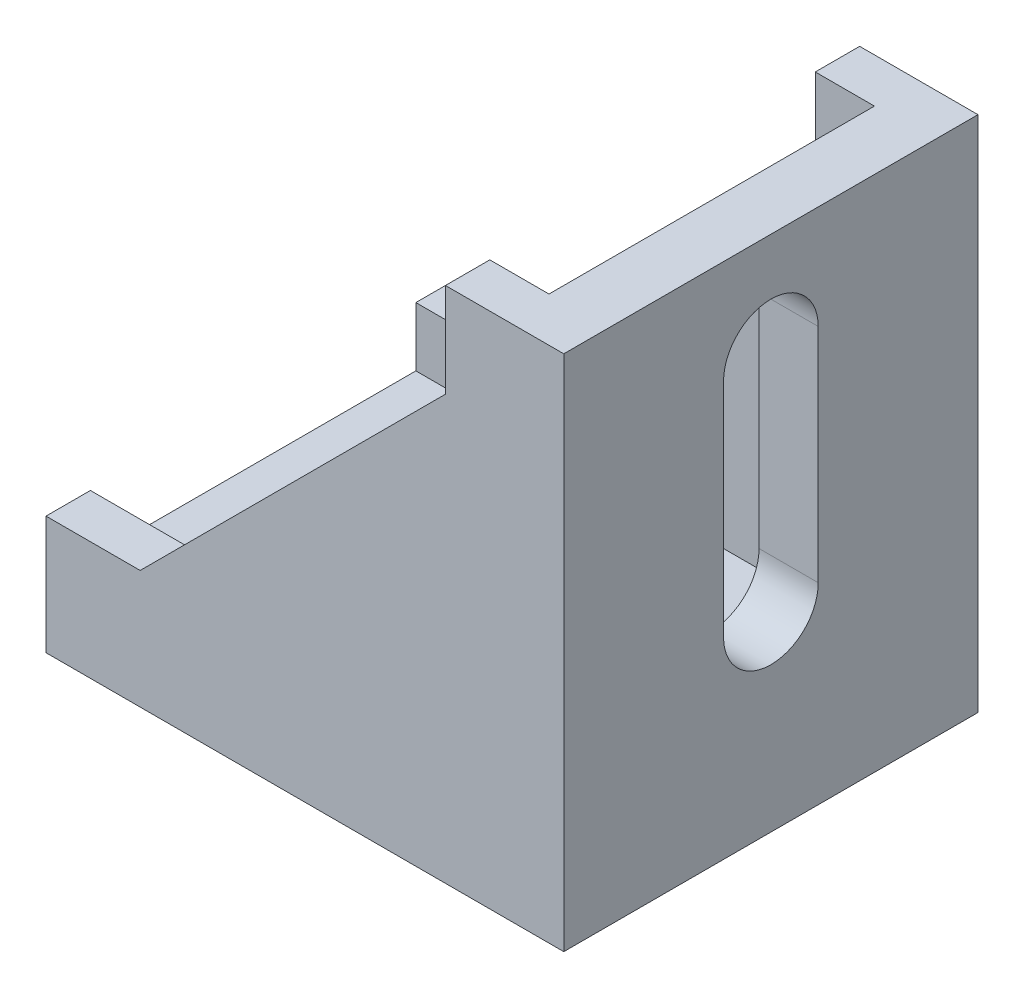
ISO-10303-21;
HEADER;
FILE_DESCRIPTION(('STEP AP214'),'2;1');
FILE_NAME('part.step','',(''),(''),'','','');
FILE_SCHEMA(('AUTOMOTIVE_DESIGN { 1 0 10303 214 1 1 1 1 }'));
ENDSEC;
DATA;
#1=APPLICATION_CONTEXT('core data for automotive mechanical design processes');
#2=APPLICATION_PROTOCOL_DEFINITION('international standard','automotive_design',2000,#1);
#3=PRODUCT_CONTEXT('',#1,'mechanical');
#4=PRODUCT('Part','Part','',(#3));
#5=PRODUCT_RELATED_PRODUCT_CATEGORY('part','',(#4));
#6=PRODUCT_DEFINITION_FORMATION('','',#4);
#7=PRODUCT_DEFINITION_CONTEXT('part definition',#1,'design');
#8=PRODUCT_DEFINITION('design','',#6,#7);
#9=PRODUCT_DEFINITION_SHAPE('','',#8);
#10=(LENGTH_UNIT() NAMED_UNIT(*) SI_UNIT(.MILLI.,.METRE.));
#11=(NAMED_UNIT(*) PLANE_ANGLE_UNIT() SI_UNIT($,.RADIAN.));
#12=(NAMED_UNIT(*) SI_UNIT($,.STERADIAN.) SOLID_ANGLE_UNIT());
#13=UNCERTAINTY_MEASURE_WITH_UNIT(LENGTH_MEASURE(1.E-05),#10,'distance_accuracy_value','');
#14=(GEOMETRIC_REPRESENTATION_CONTEXT(3) GLOBAL_UNCERTAINTY_ASSIGNED_CONTEXT((#13)) GLOBAL_UNIT_ASSIGNED_CONTEXT((#10,
#11,#12)) REPRESENTATION_CONTEXT('',''));
#15=CARTESIAN_POINT('',(0.,0.,0.));
#16=DIRECTION('',(0.,0.,1.));
#17=DIRECTION('',(1.,0.,0.));
#18=AXIS2_PLACEMENT_3D('',#15,#16,#17);
#19=CARTESIAN_POINT('',(-17.5,35.,14.));
#20=DIRECTION('',(1.,0.,0.));
#21=DIRECTION('',(0.,0.,-1.));
#22=AXIS2_PLACEMENT_3D('',#19,#20,#21);
#23=PLANE('',#22);
#24=DIRECTION('',(0.,-1.,0.));
#25=VECTOR('',#24,1.);
#26=CARTESIAN_POINT('',(-17.5,35.,14.));
#27=LINE('',#26,#25);
#28=CARTESIAN_POINT('',(-17.5,8.,14.));
#29=VERTEX_POINT('',#28);
#30=CARTESIAN_POINT('',(-17.5,0.,14.));
#31=VERTEX_POINT('',#30);
#32=EDGE_CURVE('E350',#29,#31,#27,.T.);
#33=ORIENTED_EDGE('',*,*,#32,.F.);
#34=DIRECTION('',(0.,0.,-1.));
#35=VECTOR('',#34,1.);
#36=CARTESIAN_POINT('',(-17.5,8.,116.335336040565));
#37=LINE('',#36,#35);
#38=CARTESIAN_POINT('',(-17.5,8.,11.));
#39=VERTEX_POINT('',#38);
#40=EDGE_CURVE('E262',#29,#39,#37,.T.);
#41=ORIENTED_EDGE('',*,*,#40,.T.);
#42=DIRECTION('',(0.,-1.,0.));
#43=VECTOR('',#42,1.);
#44=CARTESIAN_POINT('',(-17.5,35.,11.));
#45=LINE('',#44,#43);
#46=CARTESIAN_POINT('',(-17.5,4.,11.));
#47=VERTEX_POINT('',#46);
#48=EDGE_CURVE('E319',#39,#47,#45,.T.);
#49=ORIENTED_EDGE('',*,*,#48,.T.);
#50=DIRECTION('',(0.,0.,1.));
#51=VECTOR('',#50,1.);
#52=CARTESIAN_POINT('',(-17.5,4.,14.));
#53=LINE('',#52,#51);
#54=CARTESIAN_POINT('',(-17.5,4.,-11.));
#55=VERTEX_POINT('',#54);
#56=EDGE_CURVE('E354',#55,#47,#53,.T.);
#57=ORIENTED_EDGE('',*,*,#56,.F.);
#58=DIRECTION('',(0.,1.,0.));
#59=VECTOR('',#58,1.);
#60=CARTESIAN_POINT('',(-17.5,35.,-11.));
#61=LINE('',#60,#59);
#62=CARTESIAN_POINT('',(-17.5,8.,-11.));
#63=VERTEX_POINT('',#62);
#64=EDGE_CURVE('E321',#55,#63,#61,.T.);
#65=ORIENTED_EDGE('',*,*,#64,.T.);
#66=CARTESIAN_POINT('',(-17.5,8.,-13.9999999999999));
#67=VERTEX_POINT('',#66);
#68=EDGE_CURVE('E259',#63,#67,#37,.T.);
#69=ORIENTED_EDGE('',*,*,#68,.T.);
#70=DIRECTION('',(0.,-1.,0.));
#71=VECTOR('',#70,1.);
#72=CARTESIAN_POINT('',(-17.5,35.,-14.));
#73=LINE('',#72,#71);
#74=CARTESIAN_POINT('',(-17.5,0.,-14.));
#75=VERTEX_POINT('',#74);
#76=EDGE_CURVE('E333',#67,#75,#73,.T.);
#77=ORIENTED_EDGE('',*,*,#76,.T.);
#78=DIRECTION('',(0.,0.,1.));
#79=VECTOR('',#78,1.);
#80=CARTESIAN_POINT('',(-17.5,0.,14.));
#81=LINE('',#80,#79);
#82=EDGE_CURVE('E324',#75,#31,#81,.T.);
#83=ORIENTED_EDGE('',*,*,#82,.T.);
#84=EDGE_LOOP('',(#33,#41,#49,#57,#65,#69,#77,#83));
#85=FACE_BOUND('',#84,.T.);
#86=ADVANCED_FACE('F43',(#85),#23,.F.);
#87=CARTESIAN_POINT('',(17.5,35.,14.));
#88=DIRECTION('',(0.,0.,-1.));
#89=DIRECTION('',(-1.,0.,0.));
#90=AXIS2_PLACEMENT_3D('',#87,#88,#89);
#91=PLANE('',#90);
#92=DIRECTION('',(1.,0.,0.));
#93=VECTOR('',#92,1.);
#94=CARTESIAN_POINT('',(17.5,35.,14.));
#95=LINE('',#94,#93);
#96=CARTESIAN_POINT('',(9.49999999999996,35.,14.));
#97=VERTEX_POINT('',#96);
#98=CARTESIAN_POINT('',(17.5,35.,14.));
#99=VERTEX_POINT('',#98);
#100=EDGE_CURVE('E325',#97,#99,#95,.T.);
#101=ORIENTED_EDGE('',*,*,#100,.F.);
#102=DIRECTION('',(0.,-1.,0.));
#103=VECTOR('',#102,1.);
#104=CARTESIAN_POINT('',(9.49999999999996,35.,14.));
#105=LINE('',#104,#103);
#106=CARTESIAN_POINT('',(9.49999999999992,28.6347364830961,14.));
#107=VERTEX_POINT('',#106);
#108=EDGE_CURVE('E297',#97,#107,#105,.T.);
#109=ORIENTED_EDGE('',*,*,#108,.T.);
#110=DIRECTION('',(-0.707106781186546,-0.707106781186549,0.));
#111=VECTOR('',#110,1.);
#112=CARTESIAN_POINT('',(16.6826317584519,35.8173682415481,14.));
#113=LINE('',#112,#111);
#114=CARTESIAN_POINT('',(-11.1347364830961,8.,14.));
#115=VERTEX_POINT('',#114);
#116=EDGE_CURVE('E288',#107,#115,#113,.T.);
#117=ORIENTED_EDGE('',*,*,#116,.T.);
#118=DIRECTION('',(-1.,0.,0.));
#119=VECTOR('',#118,1.);
#120=CARTESIAN_POINT('',(17.5,8.,14.));
#121=LINE('',#120,#119);
#122=EDGE_CURVE('E279',#115,#29,#121,.T.);
#123=ORIENTED_EDGE('',*,*,#122,.T.);
#124=ORIENTED_EDGE('',*,*,#32,.T.);
#125=DIRECTION('',(1.,0.,0.));
#126=VECTOR('',#125,1.);
#127=CARTESIAN_POINT('',(17.5,0.,14.));
#128=LINE('',#127,#126);
#129=CARTESIAN_POINT('',(17.5,0.,14.));
#130=VERTEX_POINT('',#129);
#131=EDGE_CURVE('E336',#31,#130,#128,.T.);
#132=ORIENTED_EDGE('',*,*,#131,.T.);
#133=DIRECTION('',(0.,-1.,0.));
#134=VECTOR('',#133,1.);
#135=CARTESIAN_POINT('',(17.5,35.,14.));
#136=LINE('',#135,#134);
#137=EDGE_CURVE('E347',#99,#130,#136,.T.);
#138=ORIENTED_EDGE('',*,*,#137,.F.);
#139=EDGE_LOOP('',(#101,#109,#117,#123,#124,#132,#138));
#140=FACE_BOUND('',#139,.T.);
#141=ADVANCED_FACE('F375',(#140),#91,.F.);
#142=CARTESIAN_POINT('',(17.5,35.,14.));
#143=DIRECTION('',(-1.,0.,0.));
#144=DIRECTION('',(0.,0.,1.));
#145=AXIS2_PLACEMENT_3D('',#142,#143,#144);
#146=PLANE('',#145);
#147=DIRECTION('',(0.,-1.,0.));
#148=VECTOR('',#147,1.);
#149=CARTESIAN_POINT('',(17.5,27.9999999999999,3.20000000000002));
#150=LINE('',#149,#148);
#151=CARTESIAN_POINT('',(17.5,27.9999999999999,3.20000000000002));
#152=VERTEX_POINT('',#151);
#153=CARTESIAN_POINT('',(17.5,12.9999999999999,3.20000000000002));
#154=VERTEX_POINT('',#153);
#155=EDGE_CURVE('E211',#152,#154,#150,.T.);
#156=ORIENTED_EDGE('',*,*,#155,.F.);
#157=CARTESIAN_POINT('',(17.5,27.9999999999999,0.));
#158=DIRECTION('',(-1.,0.,0.));
#159=DIRECTION('',(0.,0.,1.));
#160=AXIS2_PLACEMENT_3D('',#157,#158,#159);
#161=CIRCLE('',#160,3.2);
#162=CARTESIAN_POINT('',(17.5,27.9999999999999,-3.19999999999998));
#163=VERTEX_POINT('',#162);
#164=EDGE_CURVE('E193',#163,#152,#161,.F.);
#165=ORIENTED_EDGE('',*,*,#164,.F.);
#166=DIRECTION('',(0.,1.,0.));
#167=VECTOR('',#166,1.);
#168=CARTESIAN_POINT('',(17.5,27.9999999999999,-3.19999999999998));
#169=LINE('',#168,#167);
#170=CARTESIAN_POINT('',(17.5,12.9999999999999,-3.19999999999998));
#171=VERTEX_POINT('',#170);
#172=EDGE_CURVE('E202',#171,#163,#169,.T.);
#173=ORIENTED_EDGE('',*,*,#172,.F.);
#174=CARTESIAN_POINT('',(17.5,12.9999999999999,0.));
#175=DIRECTION('',(-1.,0.,0.));
#176=DIRECTION('',(0.,0.,1.));
#177=AXIS2_PLACEMENT_3D('',#174,#175,#176);
#178=CIRCLE('',#177,3.2);
#179=EDGE_CURVE('E57',#154,#171,#178,.F.);
#180=ORIENTED_EDGE('',*,*,#179,.F.);
#181=EDGE_LOOP('',(#156,#165,#173,#180));
#182=FACE_BOUND('',#181,.T.);
#183=DIRECTION('',(0.,0.,-1.));
#184=VECTOR('',#183,1.);
#185=CARTESIAN_POINT('',(17.5,0.,14.));
#186=LINE('',#185,#184);
#187=CARTESIAN_POINT('',(17.5,0.,-14.));
#188=VERTEX_POINT('',#187);
#189=EDGE_CURVE('E338',#130,#188,#186,.T.);
#190=ORIENTED_EDGE('',*,*,#189,.T.);
#191=DIRECTION('',(0.,-1.,0.));
#192=VECTOR('',#191,1.);
#193=CARTESIAN_POINT('',(17.5,35.,-14.));
#194=LINE('',#193,#192);
#195=CARTESIAN_POINT('',(17.5,35.,-14.));
#196=VERTEX_POINT('',#195);
#197=EDGE_CURVE('E344',#196,#188,#194,.T.);
#198=ORIENTED_EDGE('',*,*,#197,.F.);
#199=DIRECTION('',(0.,0.,-1.));
#200=VECTOR('',#199,1.);
#201=CARTESIAN_POINT('',(17.5,35.,14.));
#202=LINE('',#201,#200);
#203=EDGE_CURVE('E327',#99,#196,#202,.T.);
#204=ORIENTED_EDGE('',*,*,#203,.F.);
#205=ORIENTED_EDGE('',*,*,#137,.T.);
#206=EDGE_LOOP('',(#190,#198,#204,#205));
#207=FACE_BOUND('',#206,.T.);
#208=ADVANCED_FACE('F208',(#182,#207),#146,.F.);
#209=CARTESIAN_POINT('',(17.5,35.,-14.));
#210=DIRECTION('',(0.,0.,1.));
#211=DIRECTION('',(1.,0.,0.));
#212=AXIS2_PLACEMENT_3D('',#209,#210,#211);
#213=PLANE('',#212);
#214=DIRECTION('',(0.707106781186546,0.707106781186549,0.));
#215=VECTOR('',#214,1.);
#216=CARTESIAN_POINT('',(16.6826317584519,35.8173682415481,-14.));
#217=LINE('',#216,#215);
#218=CARTESIAN_POINT('',(-11.1347364830961,8.,-13.9999999999999));
#219=VERTEX_POINT('',#218);
#220=CARTESIAN_POINT('',(9.49999999999992,28.6347364830961,-13.9999999999999));
#221=VERTEX_POINT('',#220);
#222=EDGE_CURVE('E285',#219,#221,#217,.T.);
#223=ORIENTED_EDGE('',*,*,#222,.T.);
#224=DIRECTION('',(0.,1.,0.));
#225=VECTOR('',#224,1.);
#226=CARTESIAN_POINT('',(9.49999999999996,35.,-14.));
#227=LINE('',#226,#225);
#228=CARTESIAN_POINT('',(9.49999999999996,35.,-13.9999999999999));
#229=VERTEX_POINT('',#228);
#230=EDGE_CURVE('E294',#221,#229,#227,.T.);
#231=ORIENTED_EDGE('',*,*,#230,.T.);
#232=DIRECTION('',(-1.,0.,0.));
#233=VECTOR('',#232,1.);
#234=CARTESIAN_POINT('',(17.5,35.,-14.));
#235=LINE('',#234,#233);
#236=EDGE_CURVE('E330',#196,#229,#235,.T.);
#237=ORIENTED_EDGE('',*,*,#236,.F.);
#238=ORIENTED_EDGE('',*,*,#197,.T.);
#239=DIRECTION('',(-1.,0.,0.));
#240=VECTOR('',#239,1.);
#241=CARTESIAN_POINT('',(17.5,0.,-14.));
#242=LINE('',#241,#240);
#243=EDGE_CURVE('E328',#188,#75,#242,.T.);
#244=ORIENTED_EDGE('',*,*,#243,.T.);
#245=ORIENTED_EDGE('',*,*,#76,.F.);
#246=DIRECTION('',(1.,0.,0.));
#247=VECTOR('',#246,1.);
#248=CARTESIAN_POINT('',(17.5,8.,-14.));
#249=LINE('',#248,#247);
#250=EDGE_CURVE('E276',#67,#219,#249,.T.);
#251=ORIENTED_EDGE('',*,*,#250,.T.);
#252=EDGE_LOOP('',(#223,#231,#237,#238,#244,#245,#251));
#253=FACE_BOUND('',#252,.T.);
#254=ADVANCED_FACE('F406',(#253),#213,.F.);
#255=CARTESIAN_POINT('',(0.,35.,0.));
#256=DIRECTION('',(0.,1.,0.));
#257=DIRECTION('',(0.,0.,1.));
#258=AXIS2_PLACEMENT_3D('',#255,#256,#257);
#259=PLANE('',#258);
#260=DIRECTION('',(0.,0.,-1.));
#261=VECTOR('',#260,1.);
#262=CARTESIAN_POINT('',(9.49999999999996,35.,116.335336040565));
#263=LINE('',#262,#261);
#264=CARTESIAN_POINT('',(9.49999999999996,35.,11.));
#265=VERTEX_POINT('',#264);
#266=EDGE_CURVE('E272',#97,#265,#263,.T.);
#267=ORIENTED_EDGE('',*,*,#266,.F.);
#268=ORIENTED_EDGE('',*,*,#100,.T.);
#269=ORIENTED_EDGE('',*,*,#203,.T.);
#270=ORIENTED_EDGE('',*,*,#236,.T.);
#271=CARTESIAN_POINT('',(9.49999999999996,35.,-10.9999999999999));
#272=VERTEX_POINT('',#271);
#273=EDGE_CURVE('E270',#272,#229,#263,.T.);
#274=ORIENTED_EDGE('',*,*,#273,.F.);
#275=DIRECTION('',(-1.,0.,0.));
#276=VECTOR('',#275,1.);
#277=CARTESIAN_POINT('',(13.5,35.,-11.));
#278=LINE('',#277,#276);
#279=CARTESIAN_POINT('',(13.5,35.,-11.));
#280=VERTEX_POINT('',#279);
#281=EDGE_CURVE('E310',#280,#272,#278,.T.);
#282=ORIENTED_EDGE('',*,*,#281,.F.);
#283=DIRECTION('',(0.,0.,-1.));
#284=VECTOR('',#283,1.);
#285=CARTESIAN_POINT('',(13.5,35.,-11.));
#286=LINE('',#285,#284);
#287=CARTESIAN_POINT('',(13.5,35.,11.));
#288=VERTEX_POINT('',#287);
#289=EDGE_CURVE('E300',#288,#280,#286,.T.);
#290=ORIENTED_EDGE('',*,*,#289,.F.);
#291=DIRECTION('',(1.,0.,0.));
#292=VECTOR('',#291,1.);
#293=CARTESIAN_POINT('',(0.,35.,11.));
#294=LINE('',#293,#292);
#295=EDGE_CURVE('E352',#265,#288,#294,.T.);
#296=ORIENTED_EDGE('',*,*,#295,.F.);
#297=EDGE_LOOP('',(#267,#268,#269,#270,#274,#282,#290,#296));
#298=FACE_BOUND('',#297,.T.);
#299=ADVANCED_FACE('F379',(#298),#259,.T.);
#300=CARTESIAN_POINT('',(0.,0.,0.));
#301=DIRECTION('',(0.,1.,0.));
#302=DIRECTION('',(0.,0.,1.));
#303=AXIS2_PLACEMENT_3D('',#300,#301,#302);
#304=PLANE('',#303);
#305=DIRECTION('',(-1.,0.,0.));
#306=VECTOR('',#305,1.);
#307=CARTESIAN_POINT('',(4.5,0.,3.2));
#308=LINE('',#307,#306);
#309=CARTESIAN_POINT('',(4.5,0.,3.2));
#310=VERTEX_POINT('',#309);
#311=CARTESIAN_POINT('',(-10.5,0.,3.2));
#312=VERTEX_POINT('',#311);
#313=EDGE_CURVE('E229',#310,#312,#308,.T.);
#314=ORIENTED_EDGE('',*,*,#313,.F.);
#315=CARTESIAN_POINT('',(4.5,0.,0.));
#316=DIRECTION('',(0.,1.,0.));
#317=DIRECTION('',(0.,0.,1.));
#318=AXIS2_PLACEMENT_3D('',#315,#316,#317);
#319=CIRCLE('',#318,3.2);
#320=CARTESIAN_POINT('',(4.5,0.,-3.2));
#321=VERTEX_POINT('',#320);
#322=EDGE_CURVE('E232',#321,#310,#319,.F.);
#323=ORIENTED_EDGE('',*,*,#322,.F.);
#324=DIRECTION('',(1.,0.,0.));
#325=VECTOR('',#324,1.);
#326=CARTESIAN_POINT('',(4.5,0.,-3.2));
#327=LINE('',#326,#325);
#328=CARTESIAN_POINT('',(-10.5,0.,-3.2));
#329=VERTEX_POINT('',#328);
#330=EDGE_CURVE('E249',#329,#321,#327,.T.);
#331=ORIENTED_EDGE('',*,*,#330,.F.);
#332=CARTESIAN_POINT('',(-10.5,0.,0.));
#333=DIRECTION('',(0.,1.,0.));
#334=DIRECTION('',(0.,0.,1.));
#335=AXIS2_PLACEMENT_3D('',#332,#333,#334);
#336=CIRCLE('',#335,3.2);
#337=EDGE_CURVE('E205',#312,#329,#336,.F.);
#338=ORIENTED_EDGE('',*,*,#337,.F.);
#339=EDGE_LOOP('',(#314,#323,#331,#338));
#340=FACE_BOUND('',#339,.T.);
#341=ORIENTED_EDGE('',*,*,#82,.F.);
#342=ORIENTED_EDGE('',*,*,#243,.F.);
#343=ORIENTED_EDGE('',*,*,#189,.F.);
#344=ORIENTED_EDGE('',*,*,#131,.F.);
#345=EDGE_LOOP('',(#341,#342,#343,#344));
#346=FACE_BOUND('',#345,.T.);
#347=ADVANCED_FACE('F402',(#340,#346),#304,.F.);
#348=CARTESIAN_POINT('',(0.,4.,0.));
#349=DIRECTION('',(0.,1.,0.));
#350=DIRECTION('',(0.,0.,1.));
#351=AXIS2_PLACEMENT_3D('',#348,#349,#350);
#352=PLANE('',#351);
#353=CARTESIAN_POINT('',(4.5,4.,0.));
#354=DIRECTION('',(0.,1.,0.));
#355=DIRECTION('',(0.,0.,1.));
#356=AXIS2_PLACEMENT_3D('',#353,#354,#355);
#357=CIRCLE('',#356,3.2);
#358=CARTESIAN_POINT('',(4.5,4.,3.2));
#359=VERTEX_POINT('',#358);
#360=CARTESIAN_POINT('',(4.5,4.,-3.2));
#361=VERTEX_POINT('',#360);
#362=EDGE_CURVE('E235',#359,#361,#357,.T.);
#363=ORIENTED_EDGE('',*,*,#362,.F.);
#364=DIRECTION('',(1.,0.,0.));
#365=VECTOR('',#364,1.);
#366=CARTESIAN_POINT('',(4.5,4.,3.2));
#367=LINE('',#366,#365);
#368=CARTESIAN_POINT('',(-10.5,4.,3.2));
#369=VERTEX_POINT('',#368);
#370=EDGE_CURVE('E243',#369,#359,#367,.T.);
#371=ORIENTED_EDGE('',*,*,#370,.F.);
#372=CARTESIAN_POINT('',(-10.5,4.,0.));
#373=DIRECTION('',(0.,1.,0.));
#374=DIRECTION('',(0.,0.,1.));
#375=AXIS2_PLACEMENT_3D('',#372,#373,#374);
#376=CIRCLE('',#375,3.2);
#377=CARTESIAN_POINT('',(-10.5,4.,-3.2));
#378=VERTEX_POINT('',#377);
#379=EDGE_CURVE('E240',#378,#369,#376,.T.);
#380=ORIENTED_EDGE('',*,*,#379,.F.);
#381=DIRECTION('',(-1.,0.,0.));
#382=VECTOR('',#381,1.);
#383=CARTESIAN_POINT('',(4.5,4.,-3.2));
#384=LINE('',#383,#382);
#385=EDGE_CURVE('E237',#361,#378,#384,.T.);
#386=ORIENTED_EDGE('',*,*,#385,.F.);
#387=EDGE_LOOP('',(#363,#371,#380,#386));
#388=FACE_BOUND('',#387,.T.);
#389=ORIENTED_EDGE('',*,*,#56,.T.);
#390=DIRECTION('',(-1.,0.,0.));
#391=VECTOR('',#390,1.);
#392=CARTESIAN_POINT('',(13.5,4.,11.));
#393=LINE('',#392,#391);
#394=CARTESIAN_POINT('',(13.5,4.,11.));
#395=VERTEX_POINT('',#394);
#396=EDGE_CURVE('E307',#395,#47,#393,.T.);
#397=ORIENTED_EDGE('',*,*,#396,.F.);
#398=DIRECTION('',(0.,0.,1.));
#399=VECTOR('',#398,1.);
#400=CARTESIAN_POINT('',(13.5,4.,-11.));
#401=LINE('',#400,#399);
#402=CARTESIAN_POINT('',(13.5,4.,-11.));
#403=VERTEX_POINT('',#402);
#404=EDGE_CURVE('E301',#403,#395,#401,.T.);
#405=ORIENTED_EDGE('',*,*,#404,.F.);
#406=DIRECTION('',(1.,0.,0.));
#407=VECTOR('',#406,1.);
#408=CARTESIAN_POINT('',(13.5,4.,-11.));
#409=LINE('',#408,#407);
#410=EDGE_CURVE('E304',#55,#403,#409,.T.);
#411=ORIENTED_EDGE('',*,*,#410,.F.);
#412=EDGE_LOOP('',(#389,#397,#405,#411));
#413=FACE_BOUND('',#412,.T.);
#414=ADVANCED_FACE('F391',(#388,#413),#352,.T.);
#415=CARTESIAN_POINT('',(13.5,-40.3348545172106,-11.));
#416=DIRECTION('',(0.,0.,-1.));
#417=DIRECTION('',(-1.,0.,0.));
#418=AXIS2_PLACEMENT_3D('',#415,#416,#417);
#419=PLANE('',#418);
#420=ORIENTED_EDGE('',*,*,#281,.T.);
#421=DIRECTION('',(0.,-1.,0.));
#422=VECTOR('',#421,1.);
#423=CARTESIAN_POINT('',(9.49999999999953,-40.3348545172106,-11.));
#424=LINE('',#423,#422);
#425=CARTESIAN_POINT('',(9.49999999999992,28.6347364830961,-10.9999999999999));
#426=VERTEX_POINT('',#425);
#427=EDGE_CURVE('E291',#272,#426,#424,.T.);
#428=ORIENTED_EDGE('',*,*,#427,.T.);
#429=DIRECTION('',(-0.707106781186546,-0.707106781186549,0.));
#430=VECTOR('',#429,1.);
#431=CARTESIAN_POINT('',(-22.9847955001534,-3.85005901705738,-11.));
#432=LINE('',#431,#430);
#433=CARTESIAN_POINT('',(-11.1347364830961,8.,-10.9999999999999));
#434=VERTEX_POINT('',#433);
#435=EDGE_CURVE('E282',#426,#434,#432,.T.);
#436=ORIENTED_EDGE('',*,*,#435,.T.);
#437=DIRECTION('',(-1.,0.,0.));
#438=VECTOR('',#437,1.);
#439=CARTESIAN_POINT('',(13.5,8.,-11.));
#440=LINE('',#439,#438);
#441=EDGE_CURVE('E273',#434,#63,#440,.T.);
#442=ORIENTED_EDGE('',*,*,#441,.T.);
#443=ORIENTED_EDGE('',*,*,#64,.F.);
#444=ORIENTED_EDGE('',*,*,#410,.T.);
#445=DIRECTION('',(0.,1.,0.));
#446=VECTOR('',#445,1.);
#447=CARTESIAN_POINT('',(13.5,-40.3348545172106,-11.));
#448=LINE('',#447,#446);
#449=EDGE_CURVE('E305',#403,#280,#448,.T.);
#450=ORIENTED_EDGE('',*,*,#449,.T.);
#451=EDGE_LOOP('',(#420,#428,#436,#442,#443,#444,#450));
#452=FACE_BOUND('',#451,.T.);
#453=ADVANCED_FACE('F458',(#452),#419,.F.);
#454=CARTESIAN_POINT('',(13.5,-40.3348545172106,11.));
#455=DIRECTION('',(0.,0.,1.));
#456=DIRECTION('',(1.,0.,0.));
#457=AXIS2_PLACEMENT_3D('',#454,#455,#456);
#458=PLANE('',#457);
#459=DIRECTION('',(0.707106781186546,0.707106781186549,0.));
#460=VECTOR('',#459,1.);
#461=CARTESIAN_POINT('',(-22.9847955001534,-3.85005901705737,11.));
#462=LINE('',#461,#460);
#463=CARTESIAN_POINT('',(-11.1347364830961,8.,11.));
#464=VERTEX_POINT('',#463);
#465=CARTESIAN_POINT('',(9.49999999999992,28.6347364830961,11.));
#466=VERTEX_POINT('',#465);
#467=EDGE_CURVE('E50',#464,#466,#462,.T.);
#468=ORIENTED_EDGE('',*,*,#467,.T.);
#469=DIRECTION('',(0.,1.,0.));
#470=VECTOR('',#469,1.);
#471=CARTESIAN_POINT('',(9.49999999999953,-40.3348545172106,11.));
#472=LINE('',#471,#470);
#473=EDGE_CURVE('E12',#466,#265,#472,.T.);
#474=ORIENTED_EDGE('',*,*,#473,.T.);
#475=ORIENTED_EDGE('',*,*,#295,.T.);
#476=DIRECTION('',(0.,1.,0.));
#477=VECTOR('',#476,1.);
#478=CARTESIAN_POINT('',(13.5,-40.3348545172106,11.));
#479=LINE('',#478,#477);
#480=EDGE_CURVE('E313',#395,#288,#479,.T.);
#481=ORIENTED_EDGE('',*,*,#480,.F.);
#482=ORIENTED_EDGE('',*,*,#396,.T.);
#483=ORIENTED_EDGE('',*,*,#48,.F.);
#484=DIRECTION('',(1.,0.,0.));
#485=VECTOR('',#484,1.);
#486=CARTESIAN_POINT('',(13.5,8.,11.));
#487=LINE('',#486,#485);
#488=EDGE_CURVE('E357',#39,#464,#487,.T.);
#489=ORIENTED_EDGE('',*,*,#488,.T.);
#490=EDGE_LOOP('',(#468,#474,#475,#481,#482,#483,#489));
#491=FACE_BOUND('',#490,.T.);
#492=ADVANCED_FACE('F362',(#491),#458,.F.);
#493=CARTESIAN_POINT('',(13.5,-40.3348545172106,-11.));
#494=DIRECTION('',(1.,0.,0.));
#495=DIRECTION('',(0.,0.,-1.));
#496=AXIS2_PLACEMENT_3D('',#493,#494,#495);
#497=PLANE('',#496);
#498=DIRECTION('',(0.,-1.,0.));
#499=VECTOR('',#498,1.);
#500=CARTESIAN_POINT('',(13.5,27.9999999999999,-3.19999999999998));
#501=LINE('',#500,#499);
#502=CARTESIAN_POINT('',(13.5,27.9999999999999,-3.19999999999998));
#503=VERTEX_POINT('',#502);
#504=CARTESIAN_POINT('',(13.5,12.9999999999999,-3.19999999999998));
#505=VERTEX_POINT('',#504);
#506=EDGE_CURVE('E213',#503,#505,#501,.T.);
#507=ORIENTED_EDGE('',*,*,#506,.F.);
#508=CARTESIAN_POINT('',(13.5,27.9999999999999,0.));
#509=DIRECTION('',(-1.,0.,0.));
#510=DIRECTION('',(0.,0.,1.));
#511=AXIS2_PLACEMENT_3D('',#508,#509,#510);
#512=CIRCLE('',#511,3.2);
#513=CARTESIAN_POINT('',(13.5,27.9999999999999,3.20000000000002));
#514=VERTEX_POINT('',#513);
#515=EDGE_CURVE('E65',#514,#503,#512,.T.);
#516=ORIENTED_EDGE('',*,*,#515,.F.);
#517=DIRECTION('',(0.,1.,0.));
#518=VECTOR('',#517,1.);
#519=CARTESIAN_POINT('',(13.5,27.9999999999999,3.20000000000002));
#520=LINE('',#519,#518);
#521=CARTESIAN_POINT('',(13.5,12.9999999999999,3.20000000000002));
#522=VERTEX_POINT('',#521);
#523=EDGE_CURVE('E199',#522,#514,#520,.T.);
#524=ORIENTED_EDGE('',*,*,#523,.F.);
#525=CARTESIAN_POINT('',(13.5,12.9999999999999,0.));
#526=DIRECTION('',(-1.,0.,0.));
#527=DIRECTION('',(0.,0.,1.));
#528=AXIS2_PLACEMENT_3D('',#525,#526,#527);
#529=CIRCLE('',#528,3.2);
#530=EDGE_CURVE('E219',#505,#522,#529,.T.);
#531=ORIENTED_EDGE('',*,*,#530,.F.);
#532=EDGE_LOOP('',(#507,#516,#524,#531));
#533=FACE_BOUND('',#532,.T.);
#534=ORIENTED_EDGE('',*,*,#404,.T.);
#535=ORIENTED_EDGE('',*,*,#480,.T.);
#536=ORIENTED_EDGE('',*,*,#289,.T.);
#537=ORIENTED_EDGE('',*,*,#449,.F.);
#538=EDGE_LOOP('',(#534,#535,#536,#537));
#539=FACE_BOUND('',#538,.T.);
#540=ADVANCED_FACE('F386',(#533,#539),#497,.F.);
#541=CARTESIAN_POINT('',(-11.1347364830961,8.,116.335336040565));
#542=DIRECTION('',(0.,-1.,0.));
#543=DIRECTION('',(0.,0.,-1.));
#544=AXIS2_PLACEMENT_3D('',#541,#542,#543);
#545=PLANE('',#544);
#546=ORIENTED_EDGE('',*,*,#122,.F.);
#547=DIRECTION('',(0.,0.,-1.));
#548=VECTOR('',#547,1.);
#549=CARTESIAN_POINT('',(-11.1347364830961,8.,116.335336040565));
#550=LINE('',#549,#548);
#551=EDGE_CURVE('E263',#115,#464,#550,.T.);
#552=ORIENTED_EDGE('',*,*,#551,.T.);
#553=ORIENTED_EDGE('',*,*,#488,.F.);
#554=ORIENTED_EDGE('',*,*,#40,.F.);
#555=EDGE_LOOP('',(#546,#552,#553,#554));
#556=FACE_BOUND('',#555,.T.);
#557=ADVANCED_FACE('F397',(#556),#545,.F.);
#558=CARTESIAN_POINT('',(9.49999999999992,28.6347364830961,116.335336040565));
#559=DIRECTION('',(0.707106781186549,-0.707106781186546,0.));
#560=DIRECTION('',(0.707106781186546,0.707106781186549,0.));
#561=AXIS2_PLACEMENT_3D('',#558,#559,#560);
#562=PLANE('',#561);
#563=ORIENTED_EDGE('',*,*,#116,.F.);
#564=DIRECTION('',(0.,0.,-1.));
#565=VECTOR('',#564,1.);
#566=CARTESIAN_POINT('',(9.49999999999992,28.6347364830961,116.335336040565));
#567=LINE('',#566,#565);
#568=EDGE_CURVE('E269',#107,#466,#567,.T.);
#569=ORIENTED_EDGE('',*,*,#568,.T.);
#570=ORIENTED_EDGE('',*,*,#467,.F.);
#571=ORIENTED_EDGE('',*,*,#551,.F.);
#572=EDGE_LOOP('',(#563,#569,#570,#571));
#573=FACE_BOUND('',#572,.T.);
#574=ADVANCED_FACE('F368',(#573),#562,.F.);
#575=CARTESIAN_POINT('',(9.49999999999996,35.,116.335336040565));
#576=DIRECTION('',(1.,0.,0.));
#577=DIRECTION('',(0.,1.,0.));
#578=AXIS2_PLACEMENT_3D('',#575,#576,#577);
#579=PLANE('',#578);
#580=ORIENTED_EDGE('',*,*,#108,.F.);
#581=ORIENTED_EDGE('',*,*,#266,.T.);
#582=ORIENTED_EDGE('',*,*,#473,.F.);
#583=ORIENTED_EDGE('',*,*,#568,.F.);
#584=EDGE_LOOP('',(#580,#581,#582,#583));
#585=FACE_BOUND('',#584,.T.);
#586=ADVANCED_FACE('F371',(#585),#579,.F.);
#587=ORIENTED_EDGE('',*,*,#230,.F.);
#588=EDGE_CURVE('E266',#426,#221,#567,.T.);
#589=ORIENTED_EDGE('',*,*,#588,.F.);
#590=ORIENTED_EDGE('',*,*,#427,.F.);
#591=ORIENTED_EDGE('',*,*,#273,.T.);
#592=EDGE_LOOP('',(#587,#589,#590,#591));
#593=FACE_BOUND('',#592,.T.);
#594=ADVANCED_FACE('F503',(#593),#579,.F.);
#595=ORIENTED_EDGE('',*,*,#222,.F.);
#596=EDGE_CURVE('E258',#434,#219,#550,.T.);
#597=ORIENTED_EDGE('',*,*,#596,.F.);
#598=ORIENTED_EDGE('',*,*,#435,.F.);
#599=ORIENTED_EDGE('',*,*,#588,.T.);
#600=EDGE_LOOP('',(#595,#597,#598,#599));
#601=FACE_BOUND('',#600,.T.);
#602=ADVANCED_FACE('F497',(#601),#562,.F.);
#603=ORIENTED_EDGE('',*,*,#250,.F.);
#604=ORIENTED_EDGE('',*,*,#68,.F.);
#605=ORIENTED_EDGE('',*,*,#441,.F.);
#606=ORIENTED_EDGE('',*,*,#596,.T.);
#607=EDGE_LOOP('',(#603,#604,#605,#606));
#608=FACE_BOUND('',#607,.T.);
#609=ADVANCED_FACE('F491',(#608),#545,.F.);
#610=CARTESIAN_POINT('',(4.5,-0.00100000000000013,0.));
#611=DIRECTION('',(0.,1.,0.));
#612=DIRECTION('',(0.,0.,1.));
#613=AXIS2_PLACEMENT_3D('',#610,#611,#612);
#614=CYLINDRICAL_SURFACE('',#613,3.2);
#615=ORIENTED_EDGE('',*,*,#322,.T.);
#616=DIRECTION('',(0.,1.,0.));
#617=VECTOR('',#616,1.);
#618=CARTESIAN_POINT('',(4.5,-0.00100000000000013,3.2));
#619=LINE('',#618,#617);
#620=EDGE_CURVE('E247',#310,#359,#619,.T.);
#621=ORIENTED_EDGE('',*,*,#620,.T.);
#622=ORIENTED_EDGE('',*,*,#362,.T.);
#623=DIRECTION('',(0.,1.,0.));
#624=VECTOR('',#623,1.);
#625=CARTESIAN_POINT('',(4.5,-0.00100000000000013,-3.2));
#626=LINE('',#625,#624);
#627=EDGE_CURVE('E246',#321,#361,#626,.T.);
#628=ORIENTED_EDGE('',*,*,#627,.F.);
#629=EDGE_LOOP('',(#615,#621,#622,#628));
#630=FACE_BOUND('',#629,.T.);
#631=ADVANCED_FACE('F521',(#630),#614,.F.);
#632=CARTESIAN_POINT('',(4.5,-0.00100000000000013,3.2));
#633=DIRECTION('',(0.,0.,1.));
#634=DIRECTION('',(1.,0.,0.));
#635=AXIS2_PLACEMENT_3D('',#632,#633,#634);
#636=PLANE('',#635);
#637=ORIENTED_EDGE('',*,*,#313,.T.);
#638=DIRECTION('',(0.,1.,0.));
#639=VECTOR('',#638,1.);
#640=CARTESIAN_POINT('',(-10.5,-0.00100000000000013,3.2));
#641=LINE('',#640,#639);
#642=EDGE_CURVE('E250',#312,#369,#641,.T.);
#643=ORIENTED_EDGE('',*,*,#642,.T.);
#644=ORIENTED_EDGE('',*,*,#370,.T.);
#645=ORIENTED_EDGE('',*,*,#620,.F.);
#646=EDGE_LOOP('',(#637,#643,#644,#645));
#647=FACE_BOUND('',#646,.T.);
#648=ADVANCED_FACE('F527',(#647),#636,.F.);
#649=CARTESIAN_POINT('',(-10.5,-0.00100000000000013,0.));
#650=DIRECTION('',(0.,1.,0.));
#651=DIRECTION('',(0.,0.,1.));
#652=AXIS2_PLACEMENT_3D('',#649,#650,#651);
#653=CYLINDRICAL_SURFACE('',#652,3.2);
#654=ORIENTED_EDGE('',*,*,#337,.T.);
#655=DIRECTION('',(0.,1.,0.));
#656=VECTOR('',#655,1.);
#657=CARTESIAN_POINT('',(-10.5,-0.00100000000000013,-3.2));
#658=LINE('',#657,#656);
#659=EDGE_CURVE('E252',#329,#378,#658,.T.);
#660=ORIENTED_EDGE('',*,*,#659,.T.);
#661=ORIENTED_EDGE('',*,*,#379,.T.);
#662=ORIENTED_EDGE('',*,*,#642,.F.);
#663=EDGE_LOOP('',(#654,#660,#661,#662));
#664=FACE_BOUND('',#663,.T.);
#665=ADVANCED_FACE('F535',(#664),#653,.F.);
#666=CARTESIAN_POINT('',(4.5,-0.00100000000000013,-3.2));
#667=DIRECTION('',(0.,0.,-1.));
#668=DIRECTION('',(-1.,0.,0.));
#669=AXIS2_PLACEMENT_3D('',#666,#667,#668);
#670=PLANE('',#669);
#671=ORIENTED_EDGE('',*,*,#330,.T.);
#672=ORIENTED_EDGE('',*,*,#627,.T.);
#673=ORIENTED_EDGE('',*,*,#385,.T.);
#674=ORIENTED_EDGE('',*,*,#659,.F.);
#675=EDGE_LOOP('',(#671,#672,#673,#674));
#676=FACE_BOUND('',#675,.T.);
#677=ADVANCED_FACE('F543',(#676),#670,.F.);
#678=CARTESIAN_POINT('',(17.501,27.9999999999999,0.));
#679=DIRECTION('',(-1.,0.,0.));
#680=DIRECTION('',(0.,0.,1.));
#681=AXIS2_PLACEMENT_3D('',#678,#679,#680);
#682=CYLINDRICAL_SURFACE('',#681,3.2);
#683=ORIENTED_EDGE('',*,*,#164,.T.);
#684=DIRECTION('',(-1.,0.,0.));
#685=VECTOR('',#684,1.);
#686=CARTESIAN_POINT('',(17.501,27.9999999999999,3.20000000000002));
#687=LINE('',#686,#685);
#688=EDGE_CURVE('E206',#152,#514,#687,.T.);
#689=ORIENTED_EDGE('',*,*,#688,.T.);
#690=ORIENTED_EDGE('',*,*,#515,.T.);
#691=DIRECTION('',(-1.,0.,0.));
#692=VECTOR('',#691,1.);
#693=CARTESIAN_POINT('',(17.501,27.9999999999999,-3.19999999999998));
#694=LINE('',#693,#692);
#695=EDGE_CURVE('E189',#163,#503,#694,.T.);
#696=ORIENTED_EDGE('',*,*,#695,.F.);
#697=EDGE_LOOP('',(#683,#689,#690,#696));
#698=FACE_BOUND('',#697,.T.);
#699=ADVANCED_FACE('F191',(#698),#682,.F.);
#700=CARTESIAN_POINT('',(17.501,27.9999999999999,3.20000000000002));
#701=DIRECTION('',(0.,0.,1.));
#702=DIRECTION('',(1.,0.,0.));
#703=AXIS2_PLACEMENT_3D('',#700,#701,#702);
#704=PLANE('',#703);
#705=ORIENTED_EDGE('',*,*,#155,.T.);
#706=DIRECTION('',(-1.,0.,0.));
#707=VECTOR('',#706,1.);
#708=CARTESIAN_POINT('',(17.501,12.9999999999999,3.20000000000002));
#709=LINE('',#708,#707);
#710=EDGE_CURVE('E225',#154,#522,#709,.T.);
#711=ORIENTED_EDGE('',*,*,#710,.T.);
#712=ORIENTED_EDGE('',*,*,#523,.T.);
#713=ORIENTED_EDGE('',*,*,#688,.F.);
#714=EDGE_LOOP('',(#705,#711,#712,#713));
#715=FACE_BOUND('',#714,.T.);
#716=ADVANCED_FACE('F556',(#715),#704,.F.);
#717=CARTESIAN_POINT('',(17.501,12.9999999999999,0.));
#718=DIRECTION('',(-1.,0.,0.));
#719=DIRECTION('',(0.,0.,1.));
#720=AXIS2_PLACEMENT_3D('',#717,#718,#719);
#721=CYLINDRICAL_SURFACE('',#720,3.2);
#722=ORIENTED_EDGE('',*,*,#179,.T.);
#723=DIRECTION('',(-1.,0.,0.));
#724=VECTOR('',#723,1.);
#725=CARTESIAN_POINT('',(17.501,12.9999999999999,-3.19999999999998));
#726=LINE('',#725,#724);
#727=EDGE_CURVE('E198',#171,#505,#726,.T.);
#728=ORIENTED_EDGE('',*,*,#727,.T.);
#729=ORIENTED_EDGE('',*,*,#530,.T.);
#730=ORIENTED_EDGE('',*,*,#710,.F.);
#731=EDGE_LOOP('',(#722,#728,#729,#730));
#732=FACE_BOUND('',#731,.T.);
#733=ADVANCED_FACE('F563',(#732),#721,.F.);
#734=CARTESIAN_POINT('',(17.501,27.9999999999999,-3.19999999999998));
#735=DIRECTION('',(0.,0.,-1.));
#736=DIRECTION('',(-1.,0.,0.));
#737=AXIS2_PLACEMENT_3D('',#734,#735,#736);
#738=PLANE('',#737);
#739=ORIENTED_EDGE('',*,*,#172,.T.);
#740=ORIENTED_EDGE('',*,*,#695,.T.);
#741=ORIENTED_EDGE('',*,*,#506,.T.);
#742=ORIENTED_EDGE('',*,*,#727,.F.);
#743=EDGE_LOOP('',(#739,#740,#741,#742));
#744=FACE_BOUND('',#743,.T.);
#745=ADVANCED_FACE('F203',(#744),#738,.F.);
#746=CLOSED_SHELL('',(#86,#141,#208,#254,#299,#347,#414,#453,#492,#540,#557,#574,#586,#594,#602,
#609,#631,#648,#665,#677,#699,#716,#733,#745));
#747=MANIFOLD_SOLID_BREP('B2',#746);
#748=ADVANCED_BREP_SHAPE_REPRESENTATION('',(#18,#747),#14);
#749=SHAPE_DEFINITION_REPRESENTATION(#9,#748);
ENDSEC;
END-ISO-10303-21;
